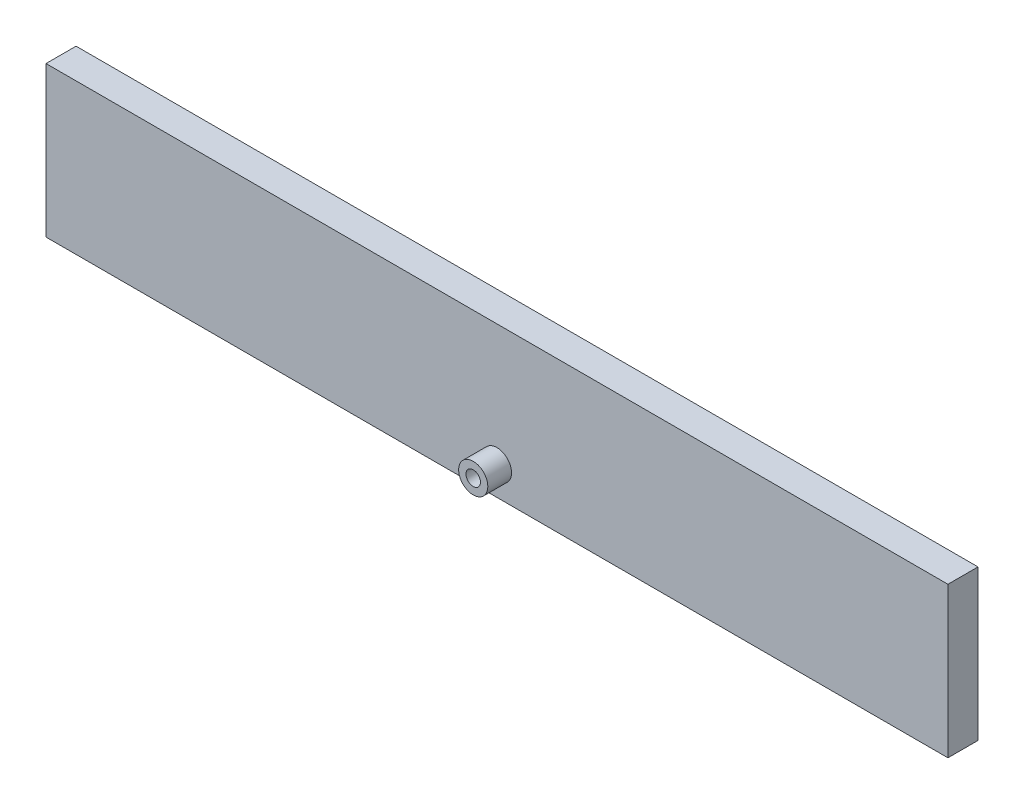
ISO-10303-21;
HEADER;
FILE_DESCRIPTION(('STEP AP214'),'2;1');
FILE_NAME('part.step','',(''),(''),'','','');
FILE_SCHEMA(('AUTOMOTIVE_DESIGN { 1 0 10303 214 1 1 1 1 }'));
ENDSEC;
DATA;
#1=APPLICATION_CONTEXT('core data for automotive mechanical design processes');
#2=APPLICATION_PROTOCOL_DEFINITION('international standard','automotive_design',2000,#1);
#3=PRODUCT_CONTEXT('',#1,'mechanical');
#4=PRODUCT('Part','Part','',(#3));
#5=PRODUCT_RELATED_PRODUCT_CATEGORY('part','',(#4));
#6=PRODUCT_DEFINITION_FORMATION('','',#4);
#7=PRODUCT_DEFINITION_CONTEXT('part definition',#1,'design');
#8=PRODUCT_DEFINITION('design','',#6,#7);
#9=PRODUCT_DEFINITION_SHAPE('','',#8);
#10=(LENGTH_UNIT() NAMED_UNIT(*) SI_UNIT(.MILLI.,.METRE.));
#11=(NAMED_UNIT(*) PLANE_ANGLE_UNIT() SI_UNIT($,.RADIAN.));
#12=(NAMED_UNIT(*) SI_UNIT($,.STERADIAN.) SOLID_ANGLE_UNIT());
#13=UNCERTAINTY_MEASURE_WITH_UNIT(LENGTH_MEASURE(1.E-05),#10,'distance_accuracy_value','');
#14=(GEOMETRIC_REPRESENTATION_CONTEXT(3) GLOBAL_UNCERTAINTY_ASSIGNED_CONTEXT((#13)) GLOBAL_UNIT_ASSIGNED_CONTEXT((#10,
#11,#12)) REPRESENTATION_CONTEXT('',''));
#15=CARTESIAN_POINT('',(0.,0.,0.));
#16=DIRECTION('',(0.,0.,1.));
#17=DIRECTION('',(1.,0.,0.));
#18=AXIS2_PLACEMENT_3D('',#15,#16,#17);
#19=CARTESIAN_POINT('',(300.,50.,20.));
#20=DIRECTION('',(-1.,0.,0.));
#21=DIRECTION('',(0.,-1.,0.));
#22=AXIS2_PLACEMENT_3D('',#19,#20,#21);
#23=PLANE('',#22);
#24=DIRECTION('',(0.,1.,0.));
#25=VECTOR('',#24,1.);
#26=CARTESIAN_POINT('',(300.,50.,0.));
#27=LINE('',#26,#25);
#28=CARTESIAN_POINT('',(300.,-50.,0.));
#29=VERTEX_POINT('',#28);
#30=CARTESIAN_POINT('',(300.,50.,0.));
#31=VERTEX_POINT('',#30);
#32=EDGE_CURVE('E99',#29,#31,#27,.T.);
#33=ORIENTED_EDGE('',*,*,#32,.T.);
#34=DIRECTION('',(0.,0.,-1.));
#35=VECTOR('',#34,1.);
#36=CARTESIAN_POINT('',(300.,50.,20.));
#37=LINE('',#36,#35);
#38=CARTESIAN_POINT('',(300.,50.,20.));
#39=VERTEX_POINT('',#38);
#40=EDGE_CURVE('E41',#39,#31,#37,.T.);
#41=ORIENTED_EDGE('',*,*,#40,.F.);
#42=DIRECTION('',(0.,1.,0.));
#43=VECTOR('',#42,1.);
#44=CARTESIAN_POINT('',(300.,50.,20.));
#45=LINE('',#44,#43);
#46=CARTESIAN_POINT('',(300.,-50.,20.));
#47=VERTEX_POINT('',#46);
#48=EDGE_CURVE('E85',#47,#39,#45,.T.);
#49=ORIENTED_EDGE('',*,*,#48,.F.);
#50=DIRECTION('',(0.,0.,-1.));
#51=VECTOR('',#50,1.);
#52=CARTESIAN_POINT('',(300.,-50.,20.));
#53=LINE('',#52,#51);
#54=EDGE_CURVE('E95',#47,#29,#53,.T.);
#55=ORIENTED_EDGE('',*,*,#54,.T.);
#56=EDGE_LOOP('',(#33,#41,#49,#55));
#57=FACE_BOUND('',#56,.T.);
#58=ADVANCED_FACE('F33',(#57),#23,.F.);
#59=CARTESIAN_POINT('',(-300.,50.,20.));
#60=DIRECTION('',(0.,-1.,0.));
#61=DIRECTION('',(0.,0.,-1.));
#62=AXIS2_PLACEMENT_3D('',#59,#60,#61);
#63=PLANE('',#62);
#64=DIRECTION('',(-1.,0.,0.));
#65=VECTOR('',#64,1.);
#66=CARTESIAN_POINT('',(-300.,50.,0.));
#67=LINE('',#66,#65);
#68=CARTESIAN_POINT('',(-300.,50.,0.));
#69=VERTEX_POINT('',#68);
#70=EDGE_CURVE('E90',#31,#69,#67,.T.);
#71=ORIENTED_EDGE('',*,*,#70,.T.);
#72=DIRECTION('',(0.,0.,-1.));
#73=VECTOR('',#72,1.);
#74=CARTESIAN_POINT('',(-300.,50.,20.));
#75=LINE('',#74,#73);
#76=CARTESIAN_POINT('',(-300.,50.,20.));
#77=VERTEX_POINT('',#76);
#78=EDGE_CURVE('E88',#77,#69,#75,.T.);
#79=ORIENTED_EDGE('',*,*,#78,.F.);
#80=DIRECTION('',(-1.,0.,0.));
#81=VECTOR('',#80,1.);
#82=CARTESIAN_POINT('',(-300.,50.,20.));
#83=LINE('',#82,#81);
#84=EDGE_CURVE('E80',#39,#77,#83,.T.);
#85=ORIENTED_EDGE('',*,*,#84,.F.);
#86=ORIENTED_EDGE('',*,*,#40,.T.);
#87=EDGE_LOOP('',(#71,#79,#85,#86));
#88=FACE_BOUND('',#87,.T.);
#89=ADVANCED_FACE('F89',(#88),#63,.F.);
#90=CARTESIAN_POINT('',(-300.,50.,20.));
#91=DIRECTION('',(1.,0.,0.));
#92=DIRECTION('',(0.,0.,-1.));
#93=AXIS2_PLACEMENT_3D('',#90,#91,#92);
#94=PLANE('',#93);
#95=DIRECTION('',(0.,-1.,0.));
#96=VECTOR('',#95,1.);
#97=CARTESIAN_POINT('',(-300.,50.,0.));
#98=LINE('',#97,#96);
#99=CARTESIAN_POINT('',(-300.,-50.,0.));
#100=VERTEX_POINT('',#99);
#101=EDGE_CURVE('E66',#69,#100,#98,.T.);
#102=ORIENTED_EDGE('',*,*,#101,.T.);
#103=DIRECTION('',(0.,0.,-1.));
#104=VECTOR('',#103,1.);
#105=CARTESIAN_POINT('',(-300.,-50.,20.));
#106=LINE('',#105,#104);
#107=CARTESIAN_POINT('',(-300.,-50.,20.));
#108=VERTEX_POINT('',#107);
#109=EDGE_CURVE('E91',#108,#100,#106,.T.);
#110=ORIENTED_EDGE('',*,*,#109,.F.);
#111=DIRECTION('',(0.,-1.,0.));
#112=VECTOR('',#111,1.);
#113=CARTESIAN_POINT('',(-300.,50.,20.));
#114=LINE('',#113,#112);
#115=EDGE_CURVE('E83',#77,#108,#114,.T.);
#116=ORIENTED_EDGE('',*,*,#115,.F.);
#117=ORIENTED_EDGE('',*,*,#78,.T.);
#118=EDGE_LOOP('',(#102,#110,#116,#117));
#119=FACE_BOUND('',#118,.T.);
#120=ADVANCED_FACE('F93',(#119),#94,.F.);
#121=CARTESIAN_POINT('',(-300.,-50.,20.));
#122=DIRECTION('',(0.,1.,0.));
#123=DIRECTION('',(0.,0.,1.));
#124=AXIS2_PLACEMENT_3D('',#121,#122,#123);
#125=PLANE('',#124);
#126=DIRECTION('',(1.,0.,0.));
#127=VECTOR('',#126,1.);
#128=CARTESIAN_POINT('',(-300.,-50.,0.));
#129=LINE('',#128,#127);
#130=EDGE_CURVE('E72',#100,#29,#129,.T.);
#131=ORIENTED_EDGE('',*,*,#130,.T.);
#132=ORIENTED_EDGE('',*,*,#54,.F.);
#133=DIRECTION('',(1.,0.,0.));
#134=VECTOR('',#133,1.);
#135=CARTESIAN_POINT('',(-300.,-50.,20.));
#136=LINE('',#135,#134);
#137=EDGE_CURVE('E49',#108,#47,#136,.T.);
#138=ORIENTED_EDGE('',*,*,#137,.F.);
#139=ORIENTED_EDGE('',*,*,#109,.T.);
#140=EDGE_LOOP('',(#131,#132,#138,#139));
#141=FACE_BOUND('',#140,.T.);
#142=ADVANCED_FACE('F121',(#141),#125,.F.);
#143=CARTESIAN_POINT('',(0.,0.,20.));
#144=DIRECTION('',(0.,0.,1.));
#145=DIRECTION('',(1.,0.,0.));
#146=AXIS2_PLACEMENT_3D('',#143,#144,#145);
#147=PLANE('',#146);
#148=CARTESIAN_POINT('',(4.44089209850063E-13,-30.95,20.));
#149=DIRECTION('',(0.,0.,1.));
#150=DIRECTION('',(1.,0.,0.));
#151=AXIS2_PLACEMENT_3D('',#148,#149,#150);
#152=CIRCLE('',#151,9.7);
#153=CARTESIAN_POINT('',(9.70000000000045,-30.95,20.));
#154=VERTEX_POINT('',#153);
#155=EDGE_CURVE('E190',#154,#154,#152,.T.);
#156=ORIENTED_EDGE('',*,*,#155,.F.);
#157=EDGE_LOOP('',(#156));
#158=FACE_BOUND('',#157,.T.);
#159=ORIENTED_EDGE('',*,*,#48,.T.);
#160=ORIENTED_EDGE('',*,*,#84,.T.);
#161=ORIENTED_EDGE('',*,*,#115,.T.);
#162=ORIENTED_EDGE('',*,*,#137,.T.);
#163=EDGE_LOOP('',(#159,#160,#161,#162));
#164=FACE_BOUND('',#163,.T.);
#165=ADVANCED_FACE('F81',(#158,#164),#147,.T.);
#166=CARTESIAN_POINT('',(0.,0.,0.));
#167=DIRECTION('',(0.,0.,1.));
#168=DIRECTION('',(1.,0.,0.));
#169=AXIS2_PLACEMENT_3D('',#166,#167,#168);
#170=PLANE('',#169);
#171=ORIENTED_EDGE('',*,*,#32,.F.);
#172=ORIENTED_EDGE('',*,*,#130,.F.);
#173=ORIENTED_EDGE('',*,*,#101,.F.);
#174=ORIENTED_EDGE('',*,*,#70,.F.);
#175=EDGE_LOOP('',(#171,#172,#173,#174));
#176=FACE_BOUND('',#175,.T.);
#177=ADVANCED_FACE('F110',(#176),#170,.F.);
#178=CARTESIAN_POINT('',(4.44089209850063E-13,-30.95,35.8));
#179=DIRECTION('',(0.,0.,1.));
#180=DIRECTION('',(1.,0.,0.));
#181=AXIS2_PLACEMENT_3D('',#178,#179,#180);
#182=PLANE('',#181);
#183=CARTESIAN_POINT('',(4.44089209850063E-13,-30.95,35.8));
#184=DIRECTION('',(0.,0.,1.));
#185=DIRECTION('',(1.,0.,0.));
#186=AXIS2_PLACEMENT_3D('',#183,#184,#185);
#187=CIRCLE('',#186,9.7);
#188=CARTESIAN_POINT('',(9.70000000000045,-30.95,35.8));
#189=VERTEX_POINT('',#188);
#190=EDGE_CURVE('E102',#189,#189,#187,.T.);
#191=ORIENTED_EDGE('',*,*,#190,.T.);
#192=EDGE_LOOP('',(#191));
#193=FACE_BOUND('',#192,.T.);
#194=CARTESIAN_POINT('',(4.44089209850063E-13,-30.95,35.8));
#195=DIRECTION('',(0.,0.,1.));
#196=DIRECTION('',(1.,0.,0.));
#197=AXIS2_PLACEMENT_3D('',#194,#195,#196);
#198=CIRCLE('',#197,4.826);
#199=CARTESIAN_POINT('',(4.82600000000044,-30.95,35.8));
#200=VERTEX_POINT('',#199);
#201=EDGE_CURVE('E188',#200,#200,#198,.T.);
#202=ORIENTED_EDGE('',*,*,#201,.F.);
#203=EDGE_LOOP('',(#202));
#204=FACE_BOUND('',#203,.T.);
#205=ADVANCED_FACE('F112',(#193,#204),#182,.T.);
#206=CARTESIAN_POINT('',(4.44089209850063E-13,-30.95,35.8));
#207=DIRECTION('',(0.,0.,-1.));
#208=DIRECTION('',(-1.,0.,0.));
#209=AXIS2_PLACEMENT_3D('',#206,#207,#208);
#210=CYLINDRICAL_SURFACE('',#209,9.7);
#211=ORIENTED_EDGE('',*,*,#190,.F.);
#212=EDGE_LOOP('',(#211));
#213=FACE_BOUND('',#212,.T.);
#214=ORIENTED_EDGE('',*,*,#155,.T.);
#215=EDGE_LOOP('',(#214));
#216=FACE_BOUND('',#215,.T.);
#217=ADVANCED_FACE('F118',(#213,#216),#210,.T.);
#218=CARTESIAN_POINT('',(4.44089209850063E-13,-30.95,35.8));
#219=DIRECTION('',(0.,0.,-1.));
#220=DIRECTION('',(-1.,0.,0.));
#221=AXIS2_PLACEMENT_3D('',#218,#219,#220);
#222=CYLINDRICAL_SURFACE('',#221,4.826);
#223=ORIENTED_EDGE('',*,*,#201,.T.);
#224=EDGE_LOOP('',(#223));
#225=FACE_BOUND('',#224,.T.);
#226=CARTESIAN_POINT('',(4.44089209850063E-13,-30.95,20.));
#227=DIRECTION('',(0.,0.,1.));
#228=DIRECTION('',(1.,0.,0.));
#229=AXIS2_PLACEMENT_3D('',#226,#227,#228);
#230=CIRCLE('',#229,4.826);
#231=CARTESIAN_POINT('',(4.82600000000044,-30.95,20.));
#232=VERTEX_POINT('',#231);
#233=EDGE_CURVE('E11',#232,#232,#230,.F.);
#234=ORIENTED_EDGE('',*,*,#233,.T.);
#235=EDGE_LOOP('',(#234));
#236=FACE_BOUND('',#235,.T.);
#237=ADVANCED_FACE('F161',(#225,#236),#222,.F.);
#238=ORIENTED_EDGE('',*,*,#233,.F.);
#239=EDGE_LOOP('',(#238));
#240=FACE_BOUND('',#239,.T.);
#241=ADVANCED_FACE('F124',(#240),#147,.T.);
#242=CLOSED_SHELL('',(#58,#89,#120,#142,#165,#177,#205,#217,#237,#241));
#243=MANIFOLD_SOLID_BREP('B2',#242);
#244=ADVANCED_BREP_SHAPE_REPRESENTATION('',(#18,#243),#14);
#245=SHAPE_DEFINITION_REPRESENTATION(#9,#244);
ENDSEC;
END-ISO-10303-21;
